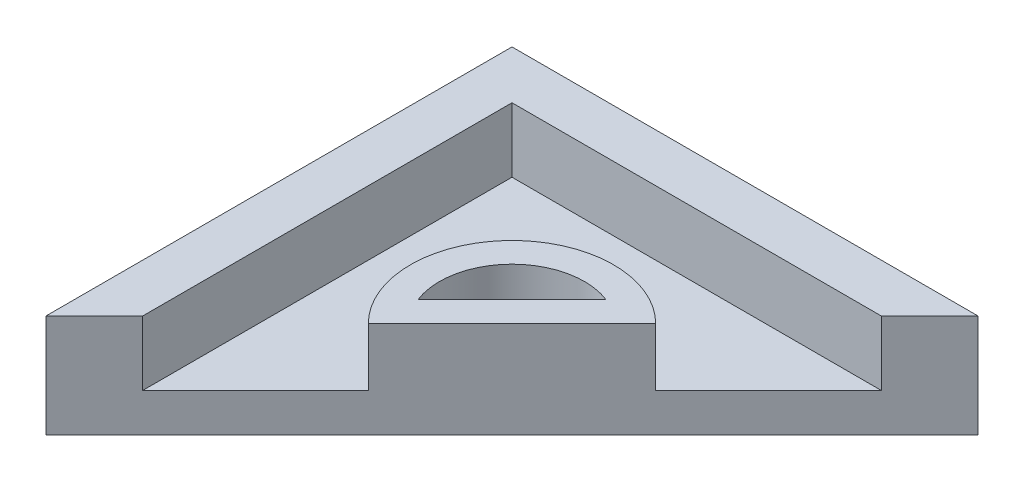
ISO-10303-21;
HEADER;
FILE_DESCRIPTION(('STEP AP214'),'2;1');
FILE_NAME('part.step','',(''),(''),'','','');
FILE_SCHEMA(('AUTOMOTIVE_DESIGN { 1 0 10303 214 1 1 1 1 }'));
ENDSEC;
DATA;
#1=APPLICATION_CONTEXT('core data for automotive mechanical design processes');
#2=APPLICATION_PROTOCOL_DEFINITION('international standard','automotive_design',2000,#1);
#3=PRODUCT_CONTEXT('',#1,'mechanical');
#4=PRODUCT('Part','Part','',(#3));
#5=PRODUCT_RELATED_PRODUCT_CATEGORY('part','',(#4));
#6=PRODUCT_DEFINITION_FORMATION('','',#4);
#7=PRODUCT_DEFINITION_CONTEXT('part definition',#1,'design');
#8=PRODUCT_DEFINITION('design','',#6,#7);
#9=PRODUCT_DEFINITION_SHAPE('','',#8);
#10=(LENGTH_UNIT() NAMED_UNIT(*) SI_UNIT(.MILLI.,.METRE.));
#11=(NAMED_UNIT(*) PLANE_ANGLE_UNIT() SI_UNIT($,.RADIAN.));
#12=(NAMED_UNIT(*) SI_UNIT($,.STERADIAN.) SOLID_ANGLE_UNIT());
#13=UNCERTAINTY_MEASURE_WITH_UNIT(LENGTH_MEASURE(1.E-05),#10,'distance_accuracy_value','');
#14=(GEOMETRIC_REPRESENTATION_CONTEXT(3) GLOBAL_UNCERTAINTY_ASSIGNED_CONTEXT((#13)) GLOBAL_UNIT_ASSIGNED_CONTEXT((#10,
#11,#12)) REPRESENTATION_CONTEXT('',''));
#15=CARTESIAN_POINT('',(0.,0.,0.));
#16=DIRECTION('',(0.,0.,1.));
#17=DIRECTION('',(1.,0.,0.));
#18=AXIS2_PLACEMENT_3D('',#15,#16,#17);
#19=CARTESIAN_POINT('',(0.,0.,0.));
#20=DIRECTION('',(0.,-1.,0.));
#21=DIRECTION('',(0.,0.,-1.));
#22=AXIS2_PLACEMENT_3D('',#19,#20,#21);
#23=PLANE('',#22);
#24=CARTESIAN_POINT('',(7.225,0.,7.225));
#25=DIRECTION('',(0.,1.,0.));
#26=DIRECTION('',(0.,0.,-1.));
#27=AXIS2_PLACEMENT_3D('',#24,#25,#26);
#28=CIRCLE('',#27,3.15);
#29=CARTESIAN_POINT('',(9.45238636073762,0.,4.99761363926237));
#30=VERTEX_POINT('',#29);
#31=CARTESIAN_POINT('',(4.99761363926237,0.,9.45238636073763));
#32=VERTEX_POINT('',#31);
#33=EDGE_CURVE('E122',#30,#32,#28,.T.);
#34=ORIENTED_EDGE('',*,*,#33,.F.);
#35=DIRECTION('',(0.707106781186548,0.,-0.707106781186548));
#36=VECTOR('',#35,1.);
#37=CARTESIAN_POINT('',(14.45,0.,0.));
#38=LINE('',#37,#36);
#39=CARTESIAN_POINT('',(12.95,0.,1.5));
#40=VERTEX_POINT('',#39);
#41=EDGE_CURVE('E132',#30,#40,#38,.T.);
#42=ORIENTED_EDGE('',*,*,#41,.T.);
#43=DIRECTION('',(1.,0.,0.));
#44=VECTOR('',#43,1.);
#45=CARTESIAN_POINT('',(12.95,0.,1.5));
#46=LINE('',#45,#44);
#47=CARTESIAN_POINT('',(1.5,0.,1.5));
#48=VERTEX_POINT('',#47);
#49=EDGE_CURVE('E149',#48,#40,#46,.T.);
#50=ORIENTED_EDGE('',*,*,#49,.F.);
#51=DIRECTION('',(0.,0.,-1.));
#52=VECTOR('',#51,1.);
#53=CARTESIAN_POINT('',(1.5,0.,1.5));
#54=LINE('',#53,#52);
#55=CARTESIAN_POINT('',(1.5,0.,12.95));
#56=VERTEX_POINT('',#55);
#57=EDGE_CURVE('E162',#56,#48,#54,.T.);
#58=ORIENTED_EDGE('',*,*,#57,.F.);
#59=EDGE_CURVE('E60',#56,#32,#38,.T.);
#60=ORIENTED_EDGE('',*,*,#59,.T.);
#61=EDGE_LOOP('',(#34,#42,#50,#58,#60));
#62=FACE_BOUND('',#61,.T.);
#63=ADVANCED_FACE('F35',(#62),#23,.F.);
#64=CARTESIAN_POINT('',(-1.26078043562562E-13,-1.2,14.4500000000001));
#65=DIRECTION('',(-1.,0.,0.));
#66=DIRECTION('',(0.,0.,1.));
#67=AXIS2_PLACEMENT_3D('',#64,#65,#66);
#68=PLANE('',#67);
#69=DIRECTION('',(0.,1.,0.));
#70=VECTOR('',#69,1.);
#71=CARTESIAN_POINT('',(-1.26078043562562E-13,-1.2,14.4500000000001));
#72=LINE('',#71,#70);
#73=CARTESIAN_POINT('',(-1.26078043562562E-13,-1.2,14.4500000000001));
#74=VERTEX_POINT('',#73);
#75=CARTESIAN_POINT('',(0.,2.,14.45));
#76=VERTEX_POINT('',#75);
#77=EDGE_CURVE('E39',#74,#76,#72,.T.);
#78=ORIENTED_EDGE('',*,*,#77,.T.);
#79=DIRECTION('',(0.,0.,1.));
#80=VECTOR('',#79,1.);
#81=CARTESIAN_POINT('',(0.,2.,14.45));
#82=LINE('',#81,#80);
#83=CARTESIAN_POINT('',(0.,2.,0.));
#84=VERTEX_POINT('',#83);
#85=EDGE_CURVE('E145',#84,#76,#82,.T.);
#86=ORIENTED_EDGE('',*,*,#85,.F.);
#87=DIRECTION('',(0.,1.,0.));
#88=VECTOR('',#87,1.);
#89=CARTESIAN_POINT('',(0.,-1.2,0.));
#90=LINE('',#89,#88);
#91=CARTESIAN_POINT('',(0.,-1.2,0.));
#92=VERTEX_POINT('',#91);
#93=EDGE_CURVE('E12',#92,#84,#90,.T.);
#94=ORIENTED_EDGE('',*,*,#93,.F.);
#95=DIRECTION('',(0.,0.,1.));
#96=VECTOR('',#95,1.);
#97=CARTESIAN_POINT('',(-1.26078043562562E-13,-1.2,14.4500000000001));
#98=LINE('',#97,#96);
#99=EDGE_CURVE('E174',#92,#74,#98,.T.);
#100=ORIENTED_EDGE('',*,*,#99,.T.);
#101=EDGE_LOOP('',(#78,#86,#94,#100));
#102=FACE_BOUND('',#101,.T.);
#103=ADVANCED_FACE('F37',(#102),#68,.T.);
#104=CARTESIAN_POINT('',(0.,-1.2,0.));
#105=DIRECTION('',(0.,0.,-1.));
#106=DIRECTION('',(-1.,0.,0.));
#107=AXIS2_PLACEMENT_3D('',#104,#105,#106);
#108=PLANE('',#107);
#109=ORIENTED_EDGE('',*,*,#93,.T.);
#110=DIRECTION('',(-1.,0.,0.));
#111=VECTOR('',#110,1.);
#112=CARTESIAN_POINT('',(0.,2.,0.));
#113=LINE('',#112,#111);
#114=CARTESIAN_POINT('',(14.45,2.,0.));
#115=VERTEX_POINT('',#114);
#116=EDGE_CURVE('E158',#115,#84,#113,.T.);
#117=ORIENTED_EDGE('',*,*,#116,.F.);
#118=DIRECTION('',(0.,1.,0.));
#119=VECTOR('',#118,1.);
#120=CARTESIAN_POINT('',(14.45,-1.2,0.));
#121=LINE('',#120,#119);
#122=CARTESIAN_POINT('',(14.45,-1.2,0.));
#123=VERTEX_POINT('',#122);
#124=EDGE_CURVE('E44',#123,#115,#121,.T.);
#125=ORIENTED_EDGE('',*,*,#124,.F.);
#126=DIRECTION('',(-1.,0.,0.));
#127=VECTOR('',#126,1.);
#128=CARTESIAN_POINT('',(0.,-1.2,0.));
#129=LINE('',#128,#127);
#130=EDGE_CURVE('E180',#123,#92,#129,.T.);
#131=ORIENTED_EDGE('',*,*,#130,.T.);
#132=EDGE_LOOP('',(#109,#117,#125,#131));
#133=FACE_BOUND('',#132,.T.);
#134=ADVANCED_FACE('F195',(#133),#108,.T.);
#135=CARTESIAN_POINT('',(14.45,-1.2,0.));
#136=DIRECTION('',(0.707106781186548,0.,0.707106781186548));
#137=DIRECTION('',(0.707106781186548,0.,-0.707106781186548));
#138=AXIS2_PLACEMENT_3D('',#135,#136,#137);
#139=PLANE('',#138);
#140=ORIENTED_EDGE('',*,*,#59,.F.);
#141=DIRECTION('',(0.,-1.,0.));
#142=VECTOR('',#141,1.);
#143=CARTESIAN_POINT('',(1.5,2.,12.95));
#144=LINE('',#143,#142);
#145=CARTESIAN_POINT('',(1.5,2.,12.95));
#146=VERTEX_POINT('',#145);
#147=EDGE_CURVE('E171',#146,#56,#144,.T.);
#148=ORIENTED_EDGE('',*,*,#147,.F.);
#149=DIRECTION('',(0.707106781186545,0.,-0.70710678118655));
#150=VECTOR('',#149,1.);
#151=CARTESIAN_POINT('',(1.5,2.,12.95));
#152=LINE('',#151,#150);
#153=EDGE_CURVE('E148',#76,#146,#152,.T.);
#154=ORIENTED_EDGE('',*,*,#153,.F.);
#155=ORIENTED_EDGE('',*,*,#77,.F.);
#156=DIRECTION('',(0.707106781186548,0.,-0.707106781186548));
#157=VECTOR('',#156,1.);
#158=CARTESIAN_POINT('',(14.45,-1.2,0.));
#159=LINE('',#158,#157);
#160=EDGE_CURVE('E177',#74,#123,#159,.T.);
#161=ORIENTED_EDGE('',*,*,#160,.T.);
#162=ORIENTED_EDGE('',*,*,#124,.T.);
#163=DIRECTION('',(0.707106781186547,0.,-0.707106781186548));
#164=VECTOR('',#163,1.);
#165=CARTESIAN_POINT('',(14.45,2.,0.));
#166=LINE('',#165,#164);
#167=CARTESIAN_POINT('',(12.95,2.,1.5));
#168=VERTEX_POINT('',#167);
#169=EDGE_CURVE('E155',#168,#115,#166,.T.);
#170=ORIENTED_EDGE('',*,*,#169,.F.);
#171=DIRECTION('',(0.,-1.,0.));
#172=VECTOR('',#171,1.);
#173=CARTESIAN_POINT('',(12.95,2.,1.5));
#174=LINE('',#173,#172);
#175=EDGE_CURVE('E161',#168,#40,#174,.T.);
#176=ORIENTED_EDGE('',*,*,#175,.T.);
#177=ORIENTED_EDGE('',*,*,#41,.F.);
#178=DIRECTION('',(0.,-1.,0.));
#179=VECTOR('',#178,1.);
#180=CARTESIAN_POINT('',(9.45238636073762,9.60477272147525,4.99761363926237));
#181=LINE('',#180,#179);
#182=CARTESIAN_POINT('',(9.45238636073762,1.8,4.99761363926237));
#183=VERTEX_POINT('',#182);
#184=EDGE_CURVE('E128',#183,#30,#181,.T.);
#185=ORIENTED_EDGE('',*,*,#184,.F.);
#186=DIRECTION('',(-0.707106781186547,0.,0.707106781186548));
#187=VECTOR('',#186,1.);
#188=CARTESIAN_POINT('',(4.99761363926238,1.8,9.45238636073762));
#189=LINE('',#188,#187);
#190=CARTESIAN_POINT('',(4.99761363926238,1.8,9.45238636073762));
#191=VERTEX_POINT('',#190);
#192=EDGE_CURVE('E114',#183,#191,#189,.T.);
#193=ORIENTED_EDGE('',*,*,#192,.T.);
#194=DIRECTION('',(0.,-1.,0.));
#195=VECTOR('',#194,1.);
#196=CARTESIAN_POINT('',(4.99761363926238,9.60477272147525,9.45238636073762));
#197=LINE('',#196,#195);
#198=EDGE_CURVE('E121',#191,#32,#197,.T.);
#199=ORIENTED_EDGE('',*,*,#198,.T.);
#200=EDGE_LOOP('',(#140,#148,#154,#155,#161,#162,#170,#176,#177,#185,#193,#199));
#201=FACE_BOUND('',#200,.T.);
#202=ADVANCED_FACE('F130',(#201),#139,.T.);
#203=CARTESIAN_POINT('',(0.,-1.2,0.));
#204=DIRECTION('',(0.,-1.,0.));
#205=DIRECTION('',(0.,0.,-1.));
#206=AXIS2_PLACEMENT_3D('',#203,#204,#205);
#207=PLANE('',#206);
#208=ORIENTED_EDGE('',*,*,#99,.F.);
#209=ORIENTED_EDGE('',*,*,#130,.F.);
#210=ORIENTED_EDGE('',*,*,#160,.F.);
#211=EDGE_LOOP('',(#208,#209,#210));
#212=FACE_BOUND('',#211,.T.);
#213=ADVANCED_FACE('F198',(#212),#207,.T.);
#214=CARTESIAN_POINT('',(1.5,2.,1.5));
#215=DIRECTION('',(-1.,0.,0.));
#216=DIRECTION('',(0.,0.,1.));
#217=AXIS2_PLACEMENT_3D('',#214,#215,#216);
#218=PLANE('',#217);
#219=ORIENTED_EDGE('',*,*,#57,.T.);
#220=DIRECTION('',(0.,-1.,0.));
#221=VECTOR('',#220,1.);
#222=CARTESIAN_POINT('',(1.5,2.,1.5));
#223=LINE('',#222,#221);
#224=CARTESIAN_POINT('',(1.5,2.,1.5));
#225=VERTEX_POINT('',#224);
#226=EDGE_CURVE('E168',#225,#48,#223,.T.);
#227=ORIENTED_EDGE('',*,*,#226,.F.);
#228=DIRECTION('',(0.,0.,-1.));
#229=VECTOR('',#228,1.);
#230=CARTESIAN_POINT('',(1.5,2.,1.5));
#231=LINE('',#230,#229);
#232=EDGE_CURVE('E151',#146,#225,#231,.T.);
#233=ORIENTED_EDGE('',*,*,#232,.F.);
#234=ORIENTED_EDGE('',*,*,#147,.T.);
#235=EDGE_LOOP('',(#219,#227,#233,#234));
#236=FACE_BOUND('',#235,.T.);
#237=ADVANCED_FACE('F200',(#236),#218,.F.);
#238=CARTESIAN_POINT('',(12.95,2.,1.5));
#239=DIRECTION('',(0.,0.,-1.));
#240=DIRECTION('',(-1.,0.,0.));
#241=AXIS2_PLACEMENT_3D('',#238,#239,#240);
#242=PLANE('',#241);
#243=ORIENTED_EDGE('',*,*,#49,.T.);
#244=ORIENTED_EDGE('',*,*,#175,.F.);
#245=DIRECTION('',(1.,0.,0.));
#246=VECTOR('',#245,1.);
#247=CARTESIAN_POINT('',(12.95,2.,1.5));
#248=LINE('',#247,#246);
#249=EDGE_CURVE('E153',#225,#168,#248,.T.);
#250=ORIENTED_EDGE('',*,*,#249,.F.);
#251=ORIENTED_EDGE('',*,*,#226,.T.);
#252=EDGE_LOOP('',(#243,#244,#250,#251));
#253=FACE_BOUND('',#252,.T.);
#254=ADVANCED_FACE('F206',(#253),#242,.F.);
#255=CARTESIAN_POINT('',(0.,2.,0.));
#256=DIRECTION('',(0.,-1.,0.));
#257=DIRECTION('',(0.,0.,-1.));
#258=AXIS2_PLACEMENT_3D('',#255,#256,#257);
#259=PLANE('',#258);
#260=ORIENTED_EDGE('',*,*,#85,.T.);
#261=ORIENTED_EDGE('',*,*,#153,.T.);
#262=ORIENTED_EDGE('',*,*,#232,.T.);
#263=ORIENTED_EDGE('',*,*,#249,.T.);
#264=ORIENTED_EDGE('',*,*,#169,.T.);
#265=ORIENTED_EDGE('',*,*,#116,.T.);
#266=EDGE_LOOP('',(#260,#261,#262,#263,#264,#265));
#267=FACE_BOUND('',#266,.T.);
#268=ADVANCED_FACE('F192',(#267),#259,.F.);
#269=CARTESIAN_POINT('',(7.225,9.60477272147525,7.225));
#270=DIRECTION('',(0.,-1.,0.));
#271=DIRECTION('',(0.,0.,-1.));
#272=AXIS2_PLACEMENT_3D('',#269,#270,#271);
#273=CYLINDRICAL_SURFACE('',#272,3.15);
#274=ORIENTED_EDGE('',*,*,#198,.F.);
#275=CARTESIAN_POINT('',(7.225,1.8,7.225));
#276=DIRECTION('',(0.,-1.,0.));
#277=DIRECTION('',(0.,0.,-1.));
#278=AXIS2_PLACEMENT_3D('',#275,#276,#277);
#279=CIRCLE('',#278,3.15);
#280=EDGE_CURVE('E117',#191,#183,#279,.T.);
#281=ORIENTED_EDGE('',*,*,#280,.T.);
#282=ORIENTED_EDGE('',*,*,#184,.T.);
#283=ORIENTED_EDGE('',*,*,#33,.T.);
#284=EDGE_LOOP('',(#274,#281,#282,#283));
#285=FACE_BOUND('',#284,.T.);
#286=ADVANCED_FACE('F126',(#285),#273,.T.);
#287=CARTESIAN_POINT('',(7.225,9.60477272147525,7.225));
#288=DIRECTION('',(0.,-1.,0.));
#289=DIRECTION('',(0.,0.,-1.));
#290=AXIS2_PLACEMENT_3D('',#287,#288,#289);
#291=CYLINDRICAL_SURFACE('',#290,2.25);
#292=CARTESIAN_POINT('',(7.225,1.8,7.225));
#293=DIRECTION('',(0.,-1.,0.));
#294=DIRECTION('',(0.,0.,-1.));
#295=AXIS2_PLACEMENT_3D('',#292,#293,#294);
#296=CIRCLE('',#295,2.25);
#297=CARTESIAN_POINT('',(5.13043723979034,1.8,8.04677055407387));
#298=VERTEX_POINT('',#297);
#299=CARTESIAN_POINT('',(8.04677055407388,1.8,5.13043723979034));
#300=VERTEX_POINT('',#299);
#301=EDGE_CURVE('E141',#298,#300,#296,.T.);
#302=ORIENTED_EDGE('',*,*,#301,.F.);
#303=DIRECTION('',(0.,-1.,0.));
#304=VECTOR('',#303,1.);
#305=CARTESIAN_POINT('',(5.13043723979034,9.60477272147525,8.04677055407387));
#306=LINE('',#305,#304);
#307=CARTESIAN_POINT('',(5.13043723979034,0.,8.04677055407387));
#308=VERTEX_POINT('',#307);
#309=EDGE_CURVE('E138',#298,#308,#306,.T.);
#310=ORIENTED_EDGE('',*,*,#309,.T.);
#311=CARTESIAN_POINT('',(7.225,0.,7.225));
#312=DIRECTION('',(0.,1.,0.));
#313=DIRECTION('',(0.,0.,-1.));
#314=AXIS2_PLACEMENT_3D('',#311,#312,#313);
#315=CIRCLE('',#314,2.25);
#316=CARTESIAN_POINT('',(8.04677055407387,0.,5.13043723979034));
#317=VERTEX_POINT('',#316);
#318=EDGE_CURVE('E52',#317,#308,#315,.T.);
#319=ORIENTED_EDGE('',*,*,#318,.F.);
#320=DIRECTION('',(0.,-1.,0.));
#321=VECTOR('',#320,1.);
#322=CARTESIAN_POINT('',(8.04677055407388,9.60477272147525,5.13043723979034));
#323=LINE('',#322,#321);
#324=EDGE_CURVE('E140',#300,#317,#323,.T.);
#325=ORIENTED_EDGE('',*,*,#324,.F.);
#326=EDGE_LOOP('',(#302,#310,#319,#325));
#327=FACE_BOUND('',#326,.T.);
#328=ADVANCED_FACE('F233',(#327),#291,.F.);
#329=CARTESIAN_POINT('',(5.13043723979034,9.60477272147525,8.04677055407387));
#330=DIRECTION('',(-0.707106781186547,0.,-0.707106781186548));
#331=DIRECTION('',(-0.707106781186548,0.,0.707106781186547));
#332=AXIS2_PLACEMENT_3D('',#329,#330,#331);
#333=PLANE('',#332);
#334=DIRECTION('',(-0.707106781186548,0.,0.707106781186547));
#335=VECTOR('',#334,1.);
#336=CARTESIAN_POINT('',(5.13043723979034,1.8,8.04677055407387));
#337=LINE('',#336,#335);
#338=EDGE_CURVE('E144',#300,#298,#337,.T.);
#339=ORIENTED_EDGE('',*,*,#338,.F.);
#340=ORIENTED_EDGE('',*,*,#324,.T.);
#341=DIRECTION('',(0.707106781186548,0.,-0.707106781186547));
#342=VECTOR('',#341,1.);
#343=CARTESIAN_POINT('',(5.13043723979034,0.,8.04677055407387));
#344=LINE('',#343,#342);
#345=EDGE_CURVE('E226',#308,#317,#344,.T.);
#346=ORIENTED_EDGE('',*,*,#345,.F.);
#347=ORIENTED_EDGE('',*,*,#309,.F.);
#348=EDGE_LOOP('',(#339,#340,#346,#347));
#349=FACE_BOUND('',#348,.T.);
#350=ADVANCED_FACE('F221',(#349),#333,.T.);
#351=CARTESIAN_POINT('',(0.,1.8,0.));
#352=DIRECTION('',(0.,-1.,0.));
#353=DIRECTION('',(0.,0.,-1.));
#354=AXIS2_PLACEMENT_3D('',#351,#352,#353);
#355=PLANE('',#354);
#356=ORIENTED_EDGE('',*,*,#301,.T.);
#357=ORIENTED_EDGE('',*,*,#338,.T.);
#358=EDGE_LOOP('',(#356,#357));
#359=FACE_BOUND('',#358,.T.);
#360=ORIENTED_EDGE('',*,*,#192,.F.);
#361=ORIENTED_EDGE('',*,*,#280,.F.);
#362=EDGE_LOOP('',(#360,#361));
#363=FACE_BOUND('',#362,.T.);
#364=ADVANCED_FACE('F116',(#359,#363),#355,.F.);
#365=ORIENTED_EDGE('',*,*,#345,.T.);
#366=ORIENTED_EDGE('',*,*,#318,.T.);
#367=EDGE_LOOP('',(#365,#366));
#368=FACE_BOUND('',#367,.T.);
#369=ADVANCED_FACE('F211',(#368),#23,.F.);
#370=CLOSED_SHELL('',(#63,#103,#134,#202,#213,#237,#254,#268,#286,#328,#350,#364,#369));
#371=MANIFOLD_SOLID_BREP('B2',#370);
#372=ADVANCED_BREP_SHAPE_REPRESENTATION('',(#18,#371),#14);
#373=SHAPE_DEFINITION_REPRESENTATION(#9,#372);
ENDSEC;
END-ISO-10303-21;
